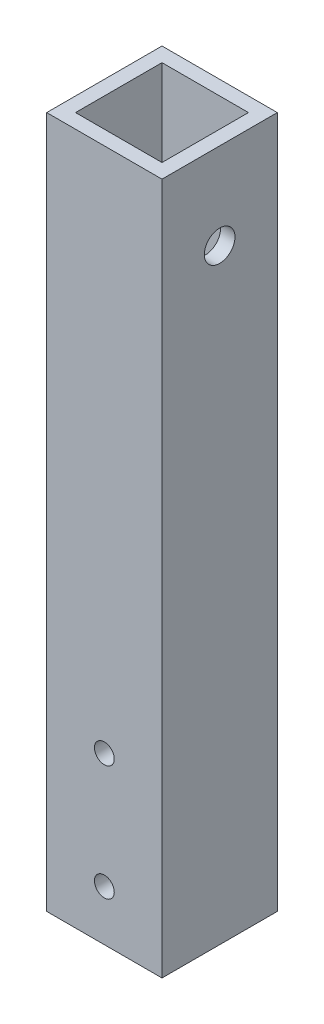
ISO-10303-21;
HEADER;
FILE_DESCRIPTION(('STEP AP214'),'2;1');
FILE_NAME('part.step','',(''),(''),'','','');
FILE_SCHEMA(('AUTOMOTIVE_DESIGN { 1 0 10303 214 1 1 1 1 }'));
ENDSEC;
DATA;
#1=APPLICATION_CONTEXT('core data for automotive mechanical design processes');
#2=APPLICATION_PROTOCOL_DEFINITION('international standard','automotive_design',2000,#1);
#3=PRODUCT_CONTEXT('',#1,'mechanical');
#4=PRODUCT('Part','Part','',(#3));
#5=PRODUCT_RELATED_PRODUCT_CATEGORY('part','',(#4));
#6=PRODUCT_DEFINITION_FORMATION('','',#4);
#7=PRODUCT_DEFINITION_CONTEXT('part definition',#1,'design');
#8=PRODUCT_DEFINITION('design','',#6,#7);
#9=PRODUCT_DEFINITION_SHAPE('','',#8);
#10=(LENGTH_UNIT() NAMED_UNIT(*) SI_UNIT(.MILLI.,.METRE.));
#11=(NAMED_UNIT(*) PLANE_ANGLE_UNIT() SI_UNIT($,.RADIAN.));
#12=(NAMED_UNIT(*) SI_UNIT($,.STERADIAN.) SOLID_ANGLE_UNIT());
#13=UNCERTAINTY_MEASURE_WITH_UNIT(LENGTH_MEASURE(1.E-05),#10,'distance_accuracy_value','');
#14=(GEOMETRIC_REPRESENTATION_CONTEXT(3) GLOBAL_UNCERTAINTY_ASSIGNED_CONTEXT((#13)) GLOBAL_UNIT_ASSIGNED_CONTEXT((#10,
#11,#12)) REPRESENTATION_CONTEXT('',''));
#15=CARTESIAN_POINT('',(0.,0.,0.));
#16=DIRECTION('',(0.,0.,1.));
#17=DIRECTION('',(1.,0.,0.));
#18=AXIS2_PLACEMENT_3D('',#15,#16,#17);
#19=CARTESIAN_POINT('',(0.,152.4,0.));
#20=DIRECTION('',(0.,-1.,0.));
#21=DIRECTION('',(0.,0.,-1.));
#22=AXIS2_PLACEMENT_3D('',#19,#20,#21);
#23=PLANE('',#22);
#24=DIRECTION('',(0.,0.,1.));
#25=VECTOR('',#24,1.);
#26=CARTESIAN_POINT('',(-12.7,152.4,12.7));
#27=LINE('',#26,#25);
#28=CARTESIAN_POINT('',(-12.7,152.4,-12.7));
#29=VERTEX_POINT('',#28);
#30=CARTESIAN_POINT('',(-12.7,152.4,12.7));
#31=VERTEX_POINT('',#30);
#32=EDGE_CURVE('E138',#29,#31,#27,.T.);
#33=ORIENTED_EDGE('',*,*,#32,.T.);
#34=DIRECTION('',(1.,0.,0.));
#35=VECTOR('',#34,1.);
#36=CARTESIAN_POINT('',(-12.7,152.4,12.7));
#37=LINE('',#36,#35);
#38=CARTESIAN_POINT('',(12.7,152.4,12.7));
#39=VERTEX_POINT('',#38);
#40=EDGE_CURVE('E141',#31,#39,#37,.T.);
#41=ORIENTED_EDGE('',*,*,#40,.T.);
#42=DIRECTION('',(0.,0.,-1.));
#43=VECTOR('',#42,1.);
#44=CARTESIAN_POINT('',(12.7,152.4,12.7));
#45=LINE('',#44,#43);
#46=CARTESIAN_POINT('',(12.7,152.4,-12.7));
#47=VERTEX_POINT('',#46);
#48=EDGE_CURVE('E144',#39,#47,#45,.T.);
#49=ORIENTED_EDGE('',*,*,#48,.T.);
#50=DIRECTION('',(-1.,0.,0.));
#51=VECTOR('',#50,1.);
#52=CARTESIAN_POINT('',(-12.7,152.4,-12.7));
#53=LINE('',#52,#51);
#54=EDGE_CURVE('E146',#47,#29,#53,.T.);
#55=ORIENTED_EDGE('',*,*,#54,.T.);
#56=EDGE_LOOP('',(#33,#41,#49,#55));
#57=FACE_BOUND('',#56,.T.);
#58=DIRECTION('',(0.,0.,-1.));
#59=VECTOR('',#58,1.);
#60=CARTESIAN_POINT('',(9.52500000000001,152.4,9.525));
#61=LINE('',#60,#59);
#62=CARTESIAN_POINT('',(9.52500000000001,152.4,9.525));
#63=VERTEX_POINT('',#62);
#64=CARTESIAN_POINT('',(9.525,152.4,-9.52500000000001));
#65=VERTEX_POINT('',#64);
#66=EDGE_CURVE('E100',#63,#65,#61,.T.);
#67=ORIENTED_EDGE('',*,*,#66,.F.);
#68=DIRECTION('',(1.,0.,0.));
#69=VECTOR('',#68,1.);
#70=CARTESIAN_POINT('',(-9.52500000000001,152.4,9.52500000000001));
#71=LINE('',#70,#69);
#72=CARTESIAN_POINT('',(-9.52500000000001,152.4,9.52500000000001));
#73=VERTEX_POINT('',#72);
#74=EDGE_CURVE('E122',#73,#63,#71,.T.);
#75=ORIENTED_EDGE('',*,*,#74,.F.);
#76=DIRECTION('',(0.,0.,1.));
#77=VECTOR('',#76,1.);
#78=CARTESIAN_POINT('',(-9.52500000000001,152.4,9.52500000000001));
#79=LINE('',#78,#77);
#80=CARTESIAN_POINT('',(-9.52500000000001,152.4,-9.52500000000001));
#81=VERTEX_POINT('',#80);
#82=EDGE_CURVE('E120',#81,#73,#79,.T.);
#83=ORIENTED_EDGE('',*,*,#82,.F.);
#84=DIRECTION('',(-1.,0.,0.));
#85=VECTOR('',#84,1.);
#86=CARTESIAN_POINT('',(-9.52500000000001,152.4,-9.52500000000001));
#87=LINE('',#86,#85);
#88=EDGE_CURVE('E108',#65,#81,#87,.T.);
#89=ORIENTED_EDGE('',*,*,#88,.F.);
#90=EDGE_LOOP('',(#67,#75,#83,#89));
#91=FACE_BOUND('',#90,.T.);
#92=ADVANCED_FACE('F33',(#57,#91),#23,.F.);
#93=CARTESIAN_POINT('',(0.,0.,0.));
#94=DIRECTION('',(0.,-1.,0.));
#95=DIRECTION('',(0.,0.,-1.));
#96=AXIS2_PLACEMENT_3D('',#93,#94,#95);
#97=PLANE('',#96);
#98=DIRECTION('',(0.,0.,1.));
#99=VECTOR('',#98,1.);
#100=CARTESIAN_POINT('',(-12.7,0.,12.7));
#101=LINE('',#100,#99);
#102=CARTESIAN_POINT('',(-12.7,0.,-12.7));
#103=VERTEX_POINT('',#102);
#104=CARTESIAN_POINT('',(-12.7,0.,12.7));
#105=VERTEX_POINT('',#104);
#106=EDGE_CURVE('E116',#103,#105,#101,.T.);
#107=ORIENTED_EDGE('',*,*,#106,.F.);
#108=DIRECTION('',(-1.,0.,0.));
#109=VECTOR('',#108,1.);
#110=CARTESIAN_POINT('',(-12.7,0.,-12.7));
#111=LINE('',#110,#109);
#112=CARTESIAN_POINT('',(12.7,0.,-12.7));
#113=VERTEX_POINT('',#112);
#114=EDGE_CURVE('E142',#113,#103,#111,.T.);
#115=ORIENTED_EDGE('',*,*,#114,.F.);
#116=DIRECTION('',(0.,0.,-1.));
#117=VECTOR('',#116,1.);
#118=CARTESIAN_POINT('',(12.7,0.,12.7));
#119=LINE('',#118,#117);
#120=CARTESIAN_POINT('',(12.7,0.,12.7));
#121=VERTEX_POINT('',#120);
#122=EDGE_CURVE('E153',#121,#113,#119,.T.);
#123=ORIENTED_EDGE('',*,*,#122,.F.);
#124=DIRECTION('',(1.,0.,0.));
#125=VECTOR('',#124,1.);
#126=CARTESIAN_POINT('',(-12.7,0.,12.7));
#127=LINE('',#126,#125);
#128=EDGE_CURVE('E151',#105,#121,#127,.T.);
#129=ORIENTED_EDGE('',*,*,#128,.F.);
#130=EDGE_LOOP('',(#107,#115,#123,#129));
#131=FACE_BOUND('',#130,.T.);
#132=DIRECTION('',(1.,0.,0.));
#133=VECTOR('',#132,1.);
#134=CARTESIAN_POINT('',(-9.52500000000001,0.,9.52500000000001));
#135=LINE('',#134,#133);
#136=CARTESIAN_POINT('',(-9.52500000000001,0.,9.52500000000001));
#137=VERTEX_POINT('',#136);
#138=CARTESIAN_POINT('',(9.52500000000001,0.,9.525));
#139=VERTEX_POINT('',#138);
#140=EDGE_CURVE('E109',#137,#139,#135,.T.);
#141=ORIENTED_EDGE('',*,*,#140,.T.);
#142=DIRECTION('',(0.,0.,-1.));
#143=VECTOR('',#142,1.);
#144=CARTESIAN_POINT('',(9.52500000000001,0.,9.525));
#145=LINE('',#144,#143);
#146=CARTESIAN_POINT('',(9.525,0.,-9.52500000000001));
#147=VERTEX_POINT('',#146);
#148=EDGE_CURVE('E58',#139,#147,#145,.T.);
#149=ORIENTED_EDGE('',*,*,#148,.T.);
#150=DIRECTION('',(-1.,0.,0.));
#151=VECTOR('',#150,1.);
#152=CARTESIAN_POINT('',(-9.52500000000001,0.,-9.52500000000001));
#153=LINE('',#152,#151);
#154=CARTESIAN_POINT('',(-9.52500000000001,0.,-9.52500000000001));
#155=VERTEX_POINT('',#154);
#156=EDGE_CURVE('E115',#147,#155,#153,.T.);
#157=ORIENTED_EDGE('',*,*,#156,.T.);
#158=DIRECTION('',(0.,0.,1.));
#159=VECTOR('',#158,1.);
#160=CARTESIAN_POINT('',(-9.52500000000001,0.,9.52500000000001));
#161=LINE('',#160,#159);
#162=EDGE_CURVE('E130',#155,#137,#161,.T.);
#163=ORIENTED_EDGE('',*,*,#162,.T.);
#164=EDGE_LOOP('',(#141,#149,#157,#163));
#165=FACE_BOUND('',#164,.T.);
#166=ADVANCED_FACE('F211',(#131,#165),#97,.T.);
#167=CARTESIAN_POINT('',(-12.7,152.4,12.7));
#168=DIRECTION('',(1.,0.,0.));
#169=DIRECTION('',(0.,0.,-1.));
#170=AXIS2_PLACEMENT_3D('',#167,#168,#169);
#171=PLANE('',#170);
#172=CARTESIAN_POINT('',(-12.7,133.35,0.));
#173=DIRECTION('',(1.,0.,0.));
#174=DIRECTION('',(0.,0.,-1.));
#175=AXIS2_PLACEMENT_3D('',#172,#173,#174);
#176=CIRCLE('',#175,3.37343749999999);
#177=CARTESIAN_POINT('',(-12.7,133.35,-3.37343749999999));
#178=VERTEX_POINT('',#177);
#179=EDGE_CURVE('E181',#178,#178,#176,.T.);
#180=ORIENTED_EDGE('',*,*,#179,.T.);
#181=EDGE_LOOP('',(#180));
#182=FACE_BOUND('',#181,.T.);
#183=ORIENTED_EDGE('',*,*,#106,.T.);
#184=DIRECTION('',(0.,-1.,0.));
#185=VECTOR('',#184,1.);
#186=CARTESIAN_POINT('',(-12.7,152.4,12.7));
#187=LINE('',#186,#185);
#188=EDGE_CURVE('E11',#31,#105,#187,.T.);
#189=ORIENTED_EDGE('',*,*,#188,.F.);
#190=ORIENTED_EDGE('',*,*,#32,.F.);
#191=DIRECTION('',(0.,-1.,0.));
#192=VECTOR('',#191,1.);
#193=CARTESIAN_POINT('',(-12.7,152.4,-12.7));
#194=LINE('',#193,#192);
#195=EDGE_CURVE('E148',#29,#103,#194,.T.);
#196=ORIENTED_EDGE('',*,*,#195,.T.);
#197=EDGE_LOOP('',(#183,#189,#190,#196));
#198=FACE_BOUND('',#197,.T.);
#199=ADVANCED_FACE('F35',(#182,#198),#171,.F.);
#200=CARTESIAN_POINT('',(-12.7,152.4,12.7));
#201=DIRECTION('',(0.,0.,-1.));
#202=DIRECTION('',(-1.,0.,0.));
#203=AXIS2_PLACEMENT_3D('',#200,#201,#202);
#204=PLANE('',#203);
#205=CARTESIAN_POINT('',(0.,36.5125,12.7));
#206=DIRECTION('',(0.,0.,1.));
#207=DIRECTION('',(1.,0.,0.));
#208=AXIS2_PLACEMENT_3D('',#205,#206,#207);
#209=CIRCLE('',#208,2.1828125);
#210=CARTESIAN_POINT('',(2.18281250000001,36.5125,12.7));
#211=VERTEX_POINT('',#210);
#212=EDGE_CURVE('E176',#211,#211,#209,.T.);
#213=ORIENTED_EDGE('',*,*,#212,.F.);
#214=EDGE_LOOP('',(#213));
#215=FACE_BOUND('',#214,.T.);
#216=CARTESIAN_POINT('',(0.,11.1125,12.7));
#217=DIRECTION('',(0.,0.,1.));
#218=DIRECTION('',(1.,0.,0.));
#219=AXIS2_PLACEMENT_3D('',#216,#217,#218);
#220=CIRCLE('',#219,2.1828125);
#221=CARTESIAN_POINT('',(2.18281250000002,11.1125,12.7));
#222=VERTEX_POINT('',#221);
#223=EDGE_CURVE('E173',#222,#222,#220,.T.);
#224=ORIENTED_EDGE('',*,*,#223,.F.);
#225=EDGE_LOOP('',(#224));
#226=FACE_BOUND('',#225,.T.);
#227=ORIENTED_EDGE('',*,*,#128,.T.);
#228=DIRECTION('',(0.,-1.,0.));
#229=VECTOR('',#228,1.);
#230=CARTESIAN_POINT('',(12.7,152.4,12.7));
#231=LINE('',#230,#229);
#232=EDGE_CURVE('E42',#39,#121,#231,.T.);
#233=ORIENTED_EDGE('',*,*,#232,.F.);
#234=ORIENTED_EDGE('',*,*,#40,.F.);
#235=ORIENTED_EDGE('',*,*,#188,.T.);
#236=EDGE_LOOP('',(#227,#233,#234,#235));
#237=FACE_BOUND('',#236,.T.);
#238=ADVANCED_FACE('F224',(#215,#226,#237),#204,.F.);
#239=CARTESIAN_POINT('',(12.7,152.4,12.7));
#240=DIRECTION('',(-1.,0.,0.));
#241=DIRECTION('',(0.,0.,1.));
#242=AXIS2_PLACEMENT_3D('',#239,#240,#241);
#243=PLANE('',#242);
#244=CARTESIAN_POINT('',(12.7,133.35,0.));
#245=DIRECTION('',(1.,0.,0.));
#246=DIRECTION('',(0.,0.,-1.));
#247=AXIS2_PLACEMENT_3D('',#244,#245,#246);
#248=CIRCLE('',#247,3.37343749999999);
#249=CARTESIAN_POINT('',(12.7,133.35,-3.37343749999999));
#250=VERTEX_POINT('',#249);
#251=EDGE_CURVE('E284',#250,#250,#248,.T.);
#252=ORIENTED_EDGE('',*,*,#251,.F.);
#253=EDGE_LOOP('',(#252));
#254=FACE_BOUND('',#253,.T.);
#255=ORIENTED_EDGE('',*,*,#122,.T.);
#256=DIRECTION('',(0.,-1.,0.));
#257=VECTOR('',#256,1.);
#258=CARTESIAN_POINT('',(12.7,152.4,-12.7));
#259=LINE('',#258,#257);
#260=EDGE_CURVE('E158',#47,#113,#259,.T.);
#261=ORIENTED_EDGE('',*,*,#260,.F.);
#262=ORIENTED_EDGE('',*,*,#48,.F.);
#263=ORIENTED_EDGE('',*,*,#232,.T.);
#264=EDGE_LOOP('',(#255,#261,#262,#263));
#265=FACE_BOUND('',#264,.T.);
#266=ADVANCED_FACE('F222',(#254,#265),#243,.F.);
#267=CARTESIAN_POINT('',(-12.7,152.4,-12.7));
#268=DIRECTION('',(0.,0.,1.));
#269=DIRECTION('',(1.,0.,0.));
#270=AXIS2_PLACEMENT_3D('',#267,#268,#269);
#271=PLANE('',#270);
#272=CARTESIAN_POINT('',(0.,36.5125,-12.7));
#273=DIRECTION('',(0.,0.,1.));
#274=DIRECTION('',(1.,0.,0.));
#275=AXIS2_PLACEMENT_3D('',#272,#273,#274);
#276=CIRCLE('',#275,2.1828125);
#277=CARTESIAN_POINT('',(2.18281250000001,36.5125,-12.7));
#278=VERTEX_POINT('',#277);
#279=EDGE_CURVE('E169',#278,#278,#276,.T.);
#280=ORIENTED_EDGE('',*,*,#279,.T.);
#281=EDGE_LOOP('',(#280));
#282=FACE_BOUND('',#281,.T.);
#283=CARTESIAN_POINT('',(0.,11.1125,-12.7));
#284=DIRECTION('',(0.,0.,1.));
#285=DIRECTION('',(1.,0.,0.));
#286=AXIS2_PLACEMENT_3D('',#283,#284,#285);
#287=CIRCLE('',#286,2.1828125);
#288=CARTESIAN_POINT('',(2.18281250000002,11.1125,-12.7));
#289=VERTEX_POINT('',#288);
#290=EDGE_CURVE('E165',#289,#289,#287,.T.);
#291=ORIENTED_EDGE('',*,*,#290,.T.);
#292=EDGE_LOOP('',(#291));
#293=FACE_BOUND('',#292,.T.);
#294=ORIENTED_EDGE('',*,*,#114,.T.);
#295=ORIENTED_EDGE('',*,*,#195,.F.);
#296=ORIENTED_EDGE('',*,*,#54,.F.);
#297=ORIENTED_EDGE('',*,*,#260,.T.);
#298=EDGE_LOOP('',(#294,#295,#296,#297));
#299=FACE_BOUND('',#298,.T.);
#300=ADVANCED_FACE('F206',(#282,#293,#299),#271,.F.);
#301=CARTESIAN_POINT('',(9.52500000000001,152.4,9.525));
#302=DIRECTION('',(-1.,0.,0.));
#303=DIRECTION('',(0.,0.,1.));
#304=AXIS2_PLACEMENT_3D('',#301,#302,#303);
#305=PLANE('',#304);
#306=CARTESIAN_POINT('',(9.52500000000001,133.35,0.));
#307=DIRECTION('',(-1.,0.,0.));
#308=DIRECTION('',(0.,0.,1.));
#309=AXIS2_PLACEMENT_3D('',#306,#307,#308);
#310=CIRCLE('',#309,3.37343749999999);
#311=CARTESIAN_POINT('',(9.52500000000001,133.35,3.37343749999999));
#312=VERTEX_POINT('',#311);
#313=EDGE_CURVE('E281',#312,#312,#310,.T.);
#314=ORIENTED_EDGE('',*,*,#313,.F.);
#315=EDGE_LOOP('',(#314));
#316=FACE_BOUND('',#315,.T.);
#317=ORIENTED_EDGE('',*,*,#148,.F.);
#318=DIRECTION('',(0.,-1.,0.));
#319=VECTOR('',#318,1.);
#320=CARTESIAN_POINT('',(9.52500000000001,152.4,9.525));
#321=LINE('',#320,#319);
#322=EDGE_CURVE('E104',#63,#139,#321,.T.);
#323=ORIENTED_EDGE('',*,*,#322,.F.);
#324=ORIENTED_EDGE('',*,*,#66,.T.);
#325=DIRECTION('',(0.,-1.,0.));
#326=VECTOR('',#325,1.);
#327=CARTESIAN_POINT('',(9.525,152.4,-9.52500000000001));
#328=LINE('',#327,#326);
#329=EDGE_CURVE('E103',#65,#147,#328,.T.);
#330=ORIENTED_EDGE('',*,*,#329,.T.);
#331=EDGE_LOOP('',(#317,#323,#324,#330));
#332=FACE_BOUND('',#331,.T.);
#333=ADVANCED_FACE('F102',(#316,#332),#305,.T.);
#334=CARTESIAN_POINT('',(-9.52500000000001,152.4,-9.52500000000001));
#335=DIRECTION('',(0.,0.,1.));
#336=DIRECTION('',(1.,0.,0.));
#337=AXIS2_PLACEMENT_3D('',#334,#335,#336);
#338=PLANE('',#337);
#339=CARTESIAN_POINT('',(0.,36.5125,-9.52500000000001));
#340=DIRECTION('',(0.,0.,1.));
#341=DIRECTION('',(1.,0.,0.));
#342=AXIS2_PLACEMENT_3D('',#339,#340,#341);
#343=CIRCLE('',#342,2.1828125);
#344=CARTESIAN_POINT('',(2.18281250000001,36.5125,-9.52500000000001));
#345=VERTEX_POINT('',#344);
#346=EDGE_CURVE('E168',#345,#345,#343,.T.);
#347=ORIENTED_EDGE('',*,*,#346,.F.);
#348=EDGE_LOOP('',(#347));
#349=FACE_BOUND('',#348,.T.);
#350=CARTESIAN_POINT('',(0.,11.1125,-9.52500000000001));
#351=DIRECTION('',(0.,0.,1.));
#352=DIRECTION('',(1.,0.,0.));
#353=AXIS2_PLACEMENT_3D('',#350,#351,#352);
#354=CIRCLE('',#353,2.1828125);
#355=CARTESIAN_POINT('',(2.18281250000002,11.1125,-9.52500000000001));
#356=VERTEX_POINT('',#355);
#357=EDGE_CURVE('E128',#356,#356,#354,.T.);
#358=ORIENTED_EDGE('',*,*,#357,.F.);
#359=EDGE_LOOP('',(#358));
#360=FACE_BOUND('',#359,.T.);
#361=ORIENTED_EDGE('',*,*,#156,.F.);
#362=ORIENTED_EDGE('',*,*,#329,.F.);
#363=ORIENTED_EDGE('',*,*,#88,.T.);
#364=DIRECTION('',(0.,-1.,0.));
#365=VECTOR('',#364,1.);
#366=CARTESIAN_POINT('',(-9.52500000000001,152.4,-9.52500000000001));
#367=LINE('',#366,#365);
#368=EDGE_CURVE('E117',#81,#155,#367,.T.);
#369=ORIENTED_EDGE('',*,*,#368,.T.);
#370=EDGE_LOOP('',(#361,#362,#363,#369));
#371=FACE_BOUND('',#370,.T.);
#372=ADVANCED_FACE('F112',(#349,#360,#371),#338,.T.);
#373=CARTESIAN_POINT('',(-9.52500000000001,152.4,9.52500000000001));
#374=DIRECTION('',(1.,0.,0.));
#375=DIRECTION('',(0.,0.,-1.));
#376=AXIS2_PLACEMENT_3D('',#373,#374,#375);
#377=PLANE('',#376);
#378=CARTESIAN_POINT('',(-9.52500000000001,133.35,0.));
#379=DIRECTION('',(1.,0.,0.));
#380=DIRECTION('',(0.,0.,-1.));
#381=AXIS2_PLACEMENT_3D('',#378,#379,#380);
#382=CIRCLE('',#381,3.37343749999999);
#383=CARTESIAN_POINT('',(-9.52500000000001,133.35,-3.37343749999999));
#384=VERTEX_POINT('',#383);
#385=EDGE_CURVE('E37',#384,#384,#382,.T.);
#386=ORIENTED_EDGE('',*,*,#385,.F.);
#387=EDGE_LOOP('',(#386));
#388=FACE_BOUND('',#387,.T.);
#389=ORIENTED_EDGE('',*,*,#162,.F.);
#390=ORIENTED_EDGE('',*,*,#368,.F.);
#391=ORIENTED_EDGE('',*,*,#82,.T.);
#392=DIRECTION('',(0.,-1.,0.));
#393=VECTOR('',#392,1.);
#394=CARTESIAN_POINT('',(-9.52500000000001,152.4,9.52500000000001));
#395=LINE('',#394,#393);
#396=EDGE_CURVE('E50',#73,#137,#395,.T.);
#397=ORIENTED_EDGE('',*,*,#396,.T.);
#398=EDGE_LOOP('',(#389,#390,#391,#397));
#399=FACE_BOUND('',#398,.T.);
#400=ADVANCED_FACE('F196',(#388,#399),#377,.T.);
#401=CARTESIAN_POINT('',(-9.52500000000001,152.4,9.52500000000001));
#402=DIRECTION('',(0.,0.,-1.));
#403=DIRECTION('',(-1.,0.,0.));
#404=AXIS2_PLACEMENT_3D('',#401,#402,#403);
#405=PLANE('',#404);
#406=CARTESIAN_POINT('',(0.,36.5125,9.525));
#407=DIRECTION('',(0.,0.,-1.));
#408=DIRECTION('',(-1.,0.,0.));
#409=AXIS2_PLACEMENT_3D('',#406,#407,#408);
#410=CIRCLE('',#409,2.1828125);
#411=CARTESIAN_POINT('',(-2.18281249999998,36.5125,9.525));
#412=VERTEX_POINT('',#411);
#413=EDGE_CURVE('E166',#412,#412,#410,.T.);
#414=ORIENTED_EDGE('',*,*,#413,.F.);
#415=EDGE_LOOP('',(#414));
#416=FACE_BOUND('',#415,.T.);
#417=CARTESIAN_POINT('',(0.,11.1125,9.525));
#418=DIRECTION('',(0.,0.,-1.));
#419=DIRECTION('',(-1.,0.,0.));
#420=AXIS2_PLACEMENT_3D('',#417,#418,#419);
#421=CIRCLE('',#420,2.1828125);
#422=CARTESIAN_POINT('',(-2.18281249999998,11.1125,9.525));
#423=VERTEX_POINT('',#422);
#424=EDGE_CURVE('E163',#423,#423,#421,.T.);
#425=ORIENTED_EDGE('',*,*,#424,.F.);
#426=EDGE_LOOP('',(#425));
#427=FACE_BOUND('',#426,.T.);
#428=ORIENTED_EDGE('',*,*,#140,.F.);
#429=ORIENTED_EDGE('',*,*,#396,.F.);
#430=ORIENTED_EDGE('',*,*,#74,.T.);
#431=ORIENTED_EDGE('',*,*,#322,.T.);
#432=EDGE_LOOP('',(#428,#429,#430,#431));
#433=FACE_BOUND('',#432,.T.);
#434=ADVANCED_FACE('F203',(#416,#427,#433),#405,.T.);
#435=CARTESIAN_POINT('',(0.,11.1125,-12.7));
#436=DIRECTION('',(0.,0.,1.));
#437=DIRECTION('',(1.,0.,0.));
#438=AXIS2_PLACEMENT_3D('',#435,#436,#437);
#439=CYLINDRICAL_SURFACE('',#438,2.1828125);
#440=ORIENTED_EDGE('',*,*,#424,.T.);
#441=EDGE_LOOP('',(#440));
#442=FACE_BOUND('',#441,.T.);
#443=ORIENTED_EDGE('',*,*,#223,.T.);
#444=EDGE_LOOP('',(#443));
#445=FACE_BOUND('',#444,.T.);
#446=ADVANCED_FACE('F252',(#442,#445),#439,.F.);
#447=ORIENTED_EDGE('',*,*,#357,.T.);
#448=EDGE_LOOP('',(#447));
#449=FACE_BOUND('',#448,.T.);
#450=ORIENTED_EDGE('',*,*,#290,.F.);
#451=EDGE_LOOP('',(#450));
#452=FACE_BOUND('',#451,.T.);
#453=ADVANCED_FACE('F192',(#449,#452),#439,.F.);
#454=CARTESIAN_POINT('',(0.,36.5125,-12.7));
#455=DIRECTION('',(0.,0.,1.));
#456=DIRECTION('',(1.,0.,0.));
#457=AXIS2_PLACEMENT_3D('',#454,#455,#456);
#458=CYLINDRICAL_SURFACE('',#457,2.1828125);
#459=ORIENTED_EDGE('',*,*,#413,.T.);
#460=EDGE_LOOP('',(#459));
#461=FACE_BOUND('',#460,.T.);
#462=ORIENTED_EDGE('',*,*,#212,.T.);
#463=EDGE_LOOP('',(#462));
#464=FACE_BOUND('',#463,.T.);
#465=ADVANCED_FACE('F262',(#461,#464),#458,.F.);
#466=ORIENTED_EDGE('',*,*,#346,.T.);
#467=EDGE_LOOP('',(#466));
#468=FACE_BOUND('',#467,.T.);
#469=ORIENTED_EDGE('',*,*,#279,.F.);
#470=EDGE_LOOP('',(#469));
#471=FACE_BOUND('',#470,.T.);
#472=ADVANCED_FACE('F265',(#468,#471),#458,.F.);
#473=CARTESIAN_POINT('',(-142.24,133.35,0.));
#474=DIRECTION('',(1.,0.,0.));
#475=DIRECTION('',(0.,0.,-1.));
#476=AXIS2_PLACEMENT_3D('',#473,#474,#475);
#477=CYLINDRICAL_SURFACE('',#476,3.37343749999999);
#478=CARTESIAN_POINT('',(-9.52500000000001,133.35,-3.37343749999999));
#479=CARTESIAN_POINT('',(-9.55807291666667,133.35,-3.37343749999999));
#480=CARTESIAN_POINT('',(-9.59114583333333,133.35,-3.37343749999999));
#481=CARTESIAN_POINT('',(-9.65729166666667,133.35,-3.37343749999999));
#482=CARTESIAN_POINT('',(-9.69036458333334,133.35,-3.37343749999999));
#483=CARTESIAN_POINT('',(-9.75651041666668,133.35,-3.37343749999999));
#484=CARTESIAN_POINT('',(-9.78958333333334,133.35,-3.37343749999999));
#485=CARTESIAN_POINT('',(-9.85572916666667,133.35,-3.37343749999999));
#486=CARTESIAN_POINT('',(-9.88880208333333,133.35,-3.37343749999999));
#487=CARTESIAN_POINT('',(-9.95494791666667,133.35,-3.37343749999999));
#488=CARTESIAN_POINT('',(-9.98802083333334,133.35,-3.37343749999999));
#489=CARTESIAN_POINT('',(-10.0541666666667,133.35,-3.37343749999999));
#490=CARTESIAN_POINT('',(-10.0872395833333,133.35,-3.37343749999999));
#491=CARTESIAN_POINT('',(-10.1533854166667,133.35,-3.37343749999999));
#492=CARTESIAN_POINT('',(-10.1864583333333,133.35,-3.37343749999999));
#493=CARTESIAN_POINT('',(-10.2526041666667,133.35,-3.37343749999999));
#494=CARTESIAN_POINT('',(-10.2856770833333,133.35,-3.37343749999999));
#495=CARTESIAN_POINT('',(-10.3518229166667,133.35,-3.37343749999999));
#496=CARTESIAN_POINT('',(-10.3848958333333,133.35,-3.37343749999999));
#497=CARTESIAN_POINT('',(-10.4510416666667,133.35,-3.37343749999999));
#498=CARTESIAN_POINT('',(-10.4841145833333,133.35,-3.37343749999999));
#499=CARTESIAN_POINT('',(-10.5502604166667,133.35,-3.37343749999999));
#500=CARTESIAN_POINT('',(-10.5833333333333,133.35,-3.37343749999999));
#501=CARTESIAN_POINT('',(-10.6494791666667,133.35,-3.37343749999999));
#502=CARTESIAN_POINT('',(-10.6825520833333,133.35,-3.37343749999999));
#503=CARTESIAN_POINT('',(-10.7486979166667,133.35,-3.37343749999999));
#504=CARTESIAN_POINT('',(-10.7817708333333,133.35,-3.37343749999999));
#505=CARTESIAN_POINT('',(-10.8479166666667,133.35,-3.37343749999999));
#506=CARTESIAN_POINT('',(-10.8809895833333,133.35,-3.37343749999999));
#507=CARTESIAN_POINT('',(-10.9471354166667,133.35,-3.37343749999999));
#508=CARTESIAN_POINT('',(-10.9802083333333,133.35,-3.37343749999999));
#509=CARTESIAN_POINT('',(-11.0463541666667,133.35,-3.37343749999999));
#510=CARTESIAN_POINT('',(-11.0794270833333,133.35,-3.37343749999999));
#511=CARTESIAN_POINT('',(-11.1455729166667,133.35,-3.37343749999999));
#512=CARTESIAN_POINT('',(-11.1786458333333,133.35,-3.37343749999999));
#513=CARTESIAN_POINT('',(-11.2447916666667,133.35,-3.37343749999999));
#514=CARTESIAN_POINT('',(-11.2778645833333,133.35,-3.37343749999999));
#515=CARTESIAN_POINT('',(-11.3440104166667,133.35,-3.37343749999999));
#516=CARTESIAN_POINT('',(-11.3770833333333,133.35,-3.37343749999999));
#517=CARTESIAN_POINT('',(-11.4432291666667,133.35,-3.37343749999999));
#518=CARTESIAN_POINT('',(-11.4763020833333,133.35,-3.37343749999999));
#519=CARTESIAN_POINT('',(-11.5424479166667,133.35,-3.37343749999999));
#520=CARTESIAN_POINT('',(-11.5755208333333,133.35,-3.37343749999999));
#521=CARTESIAN_POINT('',(-11.6416666666667,133.35,-3.37343749999999));
#522=CARTESIAN_POINT('',(-11.6747395833333,133.35,-3.37343749999999));
#523=CARTESIAN_POINT('',(-11.7408854166667,133.35,-3.37343749999999));
#524=CARTESIAN_POINT('',(-11.7739583333333,133.35,-3.37343749999999));
#525=CARTESIAN_POINT('',(-11.8401041666667,133.35,-3.37343749999999));
#526=CARTESIAN_POINT('',(-11.8731770833333,133.35,-3.37343749999999));
#527=CARTESIAN_POINT('',(-11.9393229166667,133.35,-3.37343749999999));
#528=CARTESIAN_POINT('',(-11.9723958333333,133.35,-3.37343749999999));
#529=CARTESIAN_POINT('',(-12.0385416666667,133.35,-3.37343749999999));
#530=CARTESIAN_POINT('',(-12.0716145833333,133.35,-3.37343749999999));
#531=CARTESIAN_POINT('',(-12.1377604166667,133.35,-3.37343749999999));
#532=CARTESIAN_POINT('',(-12.1708333333333,133.35,-3.37343749999999));
#533=CARTESIAN_POINT('',(-12.2369791666667,133.35,-3.37343749999999));
#534=CARTESIAN_POINT('',(-12.2700520833333,133.35,-3.37343749999999));
#535=CARTESIAN_POINT('',(-12.3361979166667,133.35,-3.37343749999999));
#536=CARTESIAN_POINT('',(-12.3692708333333,133.35,-3.37343749999999));
#537=CARTESIAN_POINT('',(-12.4354166666667,133.35,-3.37343749999999));
#538=CARTESIAN_POINT('',(-12.4684895833333,133.35,-3.37343749999999));
#539=CARTESIAN_POINT('',(-12.5346354166667,133.35,-3.37343749999999));
#540=CARTESIAN_POINT('',(-12.5677083333333,133.35,-3.37343749999999));
#541=CARTESIAN_POINT('',(-12.6338541666667,133.35,-3.37343749999999));
#542=CARTESIAN_POINT('',(-12.6669270833333,133.35,-3.37343749999999));
#543=CARTESIAN_POINT('',(-12.7,133.35,-3.37343749999999));
#544=B_SPLINE_CURVE_WITH_KNOTS('',3,(#478,#479,#480,#481,#482,#483,#484,#485,#486,#487,#488,
#489,#490,#491,#492,#493,#494,#495,#496,#497,#498,#499,#500,#501,#502,#503,#504,#505,#506,#507,
#508,#509,#510,#511,#512,#513,#514,#515,#516,#517,#518,#519,#520,#521,#522,#523,#524,#525,#526,
#527,#528,#529,#530,#531,#532,#533,#534,#535,#536,#537,#538,#539,#540,#541,#542,#543),
.UNSPECIFIED.,.F.,.F.,(4,2,2,2,2,2,2,2,2,2,2,2,2,2,2,2,2,2,2,2,2,2,2,2,2,2,2,2,2,2,2,2,4),(0.,
0.0992187499999908,0.198437500000009,0.29765625,0.396874999999991,0.49609375000001,0.5953125,
0.694531249999991,0.793749999999982,0.892968750000001,0.992187499999991,1.09140624999998,
1.190625,1.28984374999999,1.38906249999998,1.48828125,1.58749999999999,1.68671874999998,
1.7859375,1.88515624999999,1.98437499999998,2.08359375,2.18281249999999,2.28203124999998,
2.38125,2.48046874999999,2.57968749999998,2.67890624999997,2.77812499999999,2.87734374999998,
2.97656249999997,3.07578124999999,3.17499999999998),.UNSPECIFIED.);
#545=EDGE_CURVE('BSEAM266',#384,#178,#544,.T.);
#546=ORIENTED_EDGE('',*,*,#385,.T.);
#547=ORIENTED_EDGE('',*,*,#179,.F.);
#548=ORIENTED_EDGE('',*,*,#545,.T.);
#549=ORIENTED_EDGE('',*,*,#545,.F.);
#550=EDGE_LOOP('',(#546,#548,#547,#549));
#551=FACE_BOUND('',#550,.T.);
#552=ADVANCED_FACE('F266',(#551),#477,.F.);
#553=ORIENTED_EDGE('',*,*,#313,.T.);
#554=EDGE_LOOP('',(#553));
#555=FACE_BOUND('',#554,.T.);
#556=ORIENTED_EDGE('',*,*,#251,.T.);
#557=EDGE_LOOP('',(#556));
#558=FACE_BOUND('',#557,.T.);
#559=ADVANCED_FACE('F268',(#555,#558),#477,.F.);
#560=CLOSED_SHELL('',(#92,#166,#199,#238,#266,#300,#333,#372,#400,#434,#446,#453,#465,#472,#552,#559));
#561=MANIFOLD_SOLID_BREP('B2',#560);
#562=ADVANCED_BREP_SHAPE_REPRESENTATION('',(#18,#561),#14);
#563=SHAPE_DEFINITION_REPRESENTATION(#9,#562);
ENDSEC;
END-ISO-10303-21;
